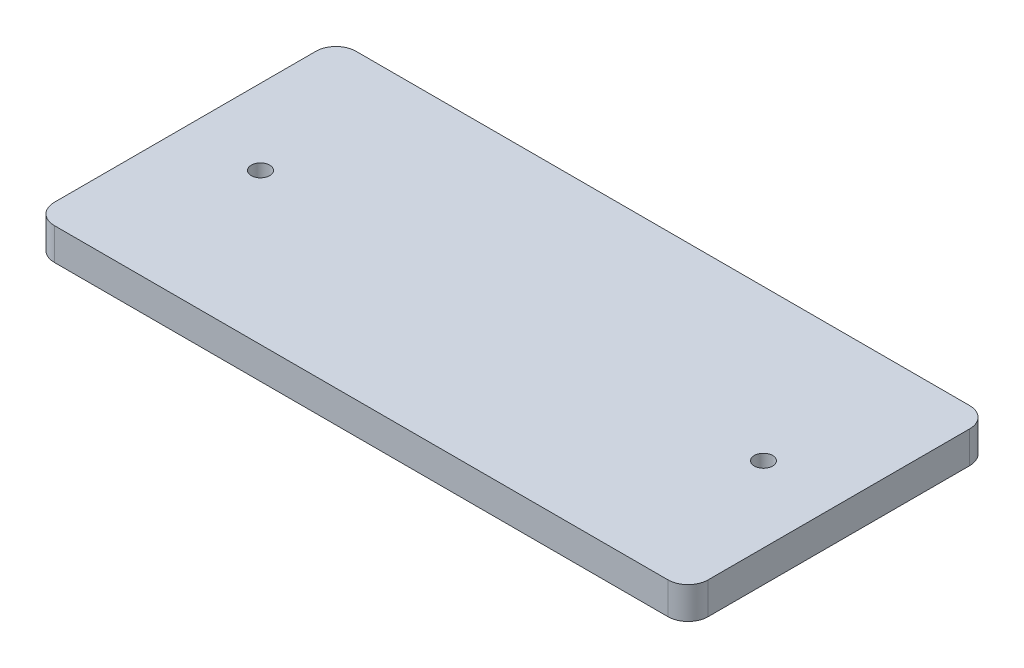
ISO-10303-21;
HEADER;
FILE_DESCRIPTION(('STEP AP214'),'2;1');
FILE_NAME('part.step','',(''),(''),'','','');
FILE_SCHEMA(('AUTOMOTIVE_DESIGN { 1 0 10303 214 1 1 1 1 }'));
ENDSEC;
DATA;
#1=APPLICATION_CONTEXT('core data for automotive mechanical design processes');
#2=APPLICATION_PROTOCOL_DEFINITION('international standard','automotive_design',2000,#1);
#3=PRODUCT_CONTEXT('',#1,'mechanical');
#4=PRODUCT('Part','Part','',(#3));
#5=PRODUCT_RELATED_PRODUCT_CATEGORY('part','',(#4));
#6=PRODUCT_DEFINITION_FORMATION('','',#4);
#7=PRODUCT_DEFINITION_CONTEXT('part definition',#1,'design');
#8=PRODUCT_DEFINITION('design','',#6,#7);
#9=PRODUCT_DEFINITION_SHAPE('','',#8);
#10=(LENGTH_UNIT() NAMED_UNIT(*) SI_UNIT(.MILLI.,.METRE.));
#11=(NAMED_UNIT(*) PLANE_ANGLE_UNIT() SI_UNIT($,.RADIAN.));
#12=(NAMED_UNIT(*) SI_UNIT($,.STERADIAN.) SOLID_ANGLE_UNIT());
#13=UNCERTAINTY_MEASURE_WITH_UNIT(LENGTH_MEASURE(1.E-05),#10,'distance_accuracy_value','');
#14=(GEOMETRIC_REPRESENTATION_CONTEXT(3) GLOBAL_UNCERTAINTY_ASSIGNED_CONTEXT((#13)) GLOBAL_UNIT_ASSIGNED_CONTEXT((#10,
#11,#12)) REPRESENTATION_CONTEXT('',''));
#15=CARTESIAN_POINT('',(0.,0.,0.));
#16=DIRECTION('',(0.,0.,1.));
#17=DIRECTION('',(1.,0.,0.));
#18=AXIS2_PLACEMENT_3D('',#15,#16,#17);
#19=CARTESIAN_POINT('',(0.,150.622,0.));
#20=DIRECTION('',(0.,1.,0.));
#21=DIRECTION('',(0.,0.,1.));
#22=AXIS2_PLACEMENT_3D('',#19,#20,#21);
#23=PLANE('',#22);
#24=CARTESIAN_POINT('',(-50.7957697616357,150.622,181.505943707725));
#25=DIRECTION('',(0.,1.,0.));
#26=DIRECTION('',(0.,0.,1.));
#27=AXIS2_PLACEMENT_3D('',#24,#25,#26);
#28=CIRCLE('',#27,1.82879999999999);
#29=CARTESIAN_POINT('',(-50.7957697616357,150.622,183.334743707725));
#30=VERTEX_POINT('',#29);
#31=EDGE_CURVE('E167',#30,#30,#28,.T.);
#32=ORIENTED_EDGE('',*,*,#31,.F.);
#33=EDGE_LOOP('',(#32));
#34=FACE_BOUND('',#33,.T.);
#35=DIRECTION('',(-1.,0.,0.));
#36=VECTOR('',#35,1.);
#37=CARTESIAN_POINT('',(-65.7957697616357,150.622,151.505943707725));
#38=LINE('',#37,#36);
#39=CARTESIAN_POINT('',(60.2042302383643,150.622,151.505943707725));
#40=VERTEX_POINT('',#39);
#41=CARTESIAN_POINT('',(-61.7957697616357,150.622,151.505943707725));
#42=VERTEX_POINT('',#41);
#43=EDGE_CURVE('E174',#40,#42,#38,.T.);
#44=ORIENTED_EDGE('',*,*,#43,.T.);
#45=CARTESIAN_POINT('',(-61.7957697616357,150.622,155.505943707725));
#46=DIRECTION('',(0.,1.,0.));
#47=DIRECTION('',(0.,0.,1.));
#48=AXIS2_PLACEMENT_3D('',#45,#46,#47);
#49=CIRCLE('',#48,4.);
#50=CARTESIAN_POINT('',(-65.7957697616357,150.622,155.505943707725));
#51=VERTEX_POINT('',#50);
#52=EDGE_CURVE('E151',#42,#51,#49,.T.);
#53=ORIENTED_EDGE('',*,*,#52,.T.);
#54=DIRECTION('',(0.,0.,1.));
#55=VECTOR('',#54,1.);
#56=CARTESIAN_POINT('',(-65.7957697616357,150.622,151.505943707725));
#57=LINE('',#56,#55);
#58=CARTESIAN_POINT('',(-65.7957697616357,150.622,207.505943707725));
#59=VERTEX_POINT('',#58);
#60=EDGE_CURVE('E121',#51,#59,#57,.T.);
#61=ORIENTED_EDGE('',*,*,#60,.T.);
#62=CARTESIAN_POINT('',(-61.7957697616356,150.622,207.505943707725));
#63=DIRECTION('',(0.,1.,0.));
#64=DIRECTION('',(0.,0.,1.));
#65=AXIS2_PLACEMENT_3D('',#62,#63,#64);
#66=CIRCLE('',#65,4.);
#67=CARTESIAN_POINT('',(-61.7957697616356,150.622,211.505943707725));
#68=VERTEX_POINT('',#67);
#69=EDGE_CURVE('E58',#59,#68,#66,.T.);
#70=ORIENTED_EDGE('',*,*,#69,.T.);
#71=DIRECTION('',(1.,0.,0.));
#72=VECTOR('',#71,1.);
#73=CARTESIAN_POINT('',(-65.7957697616357,150.622,211.505943707725));
#74=LINE('',#73,#72);
#75=CARTESIAN_POINT('',(60.2042302383643,150.622,211.505943707725));
#76=VERTEX_POINT('',#75);
#77=EDGE_CURVE('E137',#68,#76,#74,.T.);
#78=ORIENTED_EDGE('',*,*,#77,.T.);
#79=CARTESIAN_POINT('',(60.2042302383643,150.622,207.505943707725));
#80=DIRECTION('',(0.,1.,0.));
#81=DIRECTION('',(0.,0.,1.));
#82=AXIS2_PLACEMENT_3D('',#79,#80,#81);
#83=CIRCLE('',#82,4.);
#84=CARTESIAN_POINT('',(64.2042302383643,150.622,207.505943707725));
#85=VERTEX_POINT('',#84);
#86=EDGE_CURVE('E146',#76,#85,#83,.T.);
#87=ORIENTED_EDGE('',*,*,#86,.T.);
#88=DIRECTION('',(0.,0.,-1.));
#89=VECTOR('',#88,1.);
#90=CARTESIAN_POINT('',(64.2042302383643,150.622,151.505943707725));
#91=LINE('',#90,#89);
#92=CARTESIAN_POINT('',(64.2042302383643,150.622,155.505943707725));
#93=VERTEX_POINT('',#92);
#94=EDGE_CURVE('E131',#85,#93,#91,.T.);
#95=ORIENTED_EDGE('',*,*,#94,.T.);
#96=CARTESIAN_POINT('',(60.2042302383643,150.622,155.505943707725));
#97=DIRECTION('',(0.,1.,0.));
#98=DIRECTION('',(0.,0.,1.));
#99=AXIS2_PLACEMENT_3D('',#96,#97,#98);
#100=CIRCLE('',#99,4.);
#101=EDGE_CURVE('E148',#93,#40,#100,.T.);
#102=ORIENTED_EDGE('',*,*,#101,.T.);
#103=EDGE_LOOP('',(#44,#53,#61,#70,#78,#87,#95,#102));
#104=FACE_BOUND('',#103,.T.);
#105=CARTESIAN_POINT('',(49.2042302383644,150.622,181.505943707725));
#106=DIRECTION('',(0.,1.,0.));
#107=DIRECTION('',(0.,0.,1.));
#108=AXIS2_PLACEMENT_3D('',#105,#106,#107);
#109=CIRCLE('',#108,1.82879999999999);
#110=CARTESIAN_POINT('',(49.2042302383644,150.622,183.334743707725));
#111=VERTEX_POINT('',#110);
#112=EDGE_CURVE('E179',#111,#111,#109,.T.);
#113=ORIENTED_EDGE('',*,*,#112,.F.);
#114=EDGE_LOOP('',(#113));
#115=FACE_BOUND('',#114,.T.);
#116=ADVANCED_FACE('F36',(#34,#104,#115),#23,.T.);
#117=CARTESIAN_POINT('',(0.,144.272,0.));
#118=DIRECTION('',(0.,1.,0.));
#119=DIRECTION('',(0.,0.,1.));
#120=AXIS2_PLACEMENT_3D('',#117,#118,#119);
#121=PLANE('',#120);
#122=DIRECTION('',(0.,0.,1.));
#123=VECTOR('',#122,1.);
#124=CARTESIAN_POINT('',(-65.7957697616357,144.272,151.505943707725));
#125=LINE('',#124,#123);
#126=CARTESIAN_POINT('',(-65.7957697616357,144.272,155.505943707725));
#127=VERTEX_POINT('',#126);
#128=CARTESIAN_POINT('',(-65.7957697616357,144.272,207.505943707725));
#129=VERTEX_POINT('',#128);
#130=EDGE_CURVE('E119',#127,#129,#125,.T.);
#131=ORIENTED_EDGE('',*,*,#130,.F.);
#132=CARTESIAN_POINT('',(-61.7957697616357,144.272,155.505943707725));
#133=DIRECTION('',(0.,1.,0.));
#134=DIRECTION('',(0.,0.,1.));
#135=AXIS2_PLACEMENT_3D('',#132,#133,#134);
#136=CIRCLE('',#135,4.);
#137=CARTESIAN_POINT('',(-61.7957697616357,144.272,151.505943707725));
#138=VERTEX_POINT('',#137);
#139=EDGE_CURVE('E102',#127,#138,#136,.F.);
#140=ORIENTED_EDGE('',*,*,#139,.T.);
#141=DIRECTION('',(-1.,0.,0.));
#142=VECTOR('',#141,1.);
#143=CARTESIAN_POINT('',(-65.7957697616357,144.272,151.505943707725));
#144=LINE('',#143,#142);
#145=CARTESIAN_POINT('',(60.2042302383643,144.272,151.505943707725));
#146=VERTEX_POINT('',#145);
#147=EDGE_CURVE('E129',#146,#138,#144,.T.);
#148=ORIENTED_EDGE('',*,*,#147,.F.);
#149=CARTESIAN_POINT('',(60.2042302383643,144.272,155.505943707725));
#150=DIRECTION('',(0.,1.,0.));
#151=DIRECTION('',(0.,0.,1.));
#152=AXIS2_PLACEMENT_3D('',#149,#150,#151);
#153=CIRCLE('',#152,4.);
#154=CARTESIAN_POINT('',(64.2042302383643,144.272,155.505943707725));
#155=VERTEX_POINT('',#154);
#156=EDGE_CURVE('E140',#146,#155,#153,.F.);
#157=ORIENTED_EDGE('',*,*,#156,.T.);
#158=DIRECTION('',(0.,0.,-1.));
#159=VECTOR('',#158,1.);
#160=CARTESIAN_POINT('',(64.2042302383643,144.272,151.505943707725));
#161=LINE('',#160,#159);
#162=CARTESIAN_POINT('',(64.2042302383643,144.272,207.505943707725));
#163=VERTEX_POINT('',#162);
#164=EDGE_CURVE('E133',#163,#155,#161,.T.);
#165=ORIENTED_EDGE('',*,*,#164,.F.);
#166=CARTESIAN_POINT('',(60.2042302383643,144.272,207.505943707725));
#167=DIRECTION('',(0.,1.,0.));
#168=DIRECTION('',(0.,0.,1.));
#169=AXIS2_PLACEMENT_3D('',#166,#167,#168);
#170=CIRCLE('',#169,4.);
#171=CARTESIAN_POINT('',(60.2042302383643,144.272,211.505943707725));
#172=VERTEX_POINT('',#171);
#173=EDGE_CURVE('E122',#163,#172,#170,.F.);
#174=ORIENTED_EDGE('',*,*,#173,.T.);
#175=DIRECTION('',(1.,0.,0.));
#176=VECTOR('',#175,1.);
#177=CARTESIAN_POINT('',(-65.7957697616357,144.272,211.505943707725));
#178=LINE('',#177,#176);
#179=CARTESIAN_POINT('',(-61.7957697616356,144.272,211.505943707725));
#180=VERTEX_POINT('',#179);
#181=EDGE_CURVE('E128',#180,#172,#178,.T.);
#182=ORIENTED_EDGE('',*,*,#181,.F.);
#183=CARTESIAN_POINT('',(-61.7957697616356,144.272,207.505943707725));
#184=DIRECTION('',(0.,1.,0.));
#185=DIRECTION('',(0.,0.,1.));
#186=AXIS2_PLACEMENT_3D('',#183,#184,#185);
#187=CIRCLE('',#186,4.);
#188=EDGE_CURVE('E113',#180,#129,#187,.F.);
#189=ORIENTED_EDGE('',*,*,#188,.T.);
#190=EDGE_LOOP('',(#131,#140,#148,#157,#165,#174,#182,#189));
#191=FACE_BOUND('',#190,.T.);
#192=CARTESIAN_POINT('',(-50.7957697616357,144.272,181.505943707725));
#193=DIRECTION('',(0.,1.,0.));
#194=DIRECTION('',(0.,0.,1.));
#195=AXIS2_PLACEMENT_3D('',#192,#193,#194);
#196=CIRCLE('',#195,1.82879999999999);
#197=CARTESIAN_POINT('',(-50.7957697616357,144.272,183.334743707725));
#198=VERTEX_POINT('',#197);
#199=EDGE_CURVE('E169',#198,#198,#196,.T.);
#200=ORIENTED_EDGE('',*,*,#199,.T.);
#201=EDGE_LOOP('',(#200));
#202=FACE_BOUND('',#201,.T.);
#203=CARTESIAN_POINT('',(49.2042302383644,144.272,181.505943707725));
#204=DIRECTION('',(0.,1.,0.));
#205=DIRECTION('',(0.,0.,1.));
#206=AXIS2_PLACEMENT_3D('',#203,#204,#205);
#207=CIRCLE('',#206,1.82879999999999);
#208=CARTESIAN_POINT('',(49.2042302383644,144.272,183.334743707725));
#209=VERTEX_POINT('',#208);
#210=EDGE_CURVE('E181',#209,#209,#207,.T.);
#211=ORIENTED_EDGE('',*,*,#210,.T.);
#212=EDGE_LOOP('',(#211));
#213=FACE_BOUND('',#212,.T.);
#214=ADVANCED_FACE('F125',(#191,#202,#213),#121,.F.);
#215=CARTESIAN_POINT('',(64.2042302383643,150.622,151.505943707725));
#216=DIRECTION('',(-1.,0.,0.));
#217=DIRECTION('',(0.,0.,1.));
#218=AXIS2_PLACEMENT_3D('',#215,#216,#217);
#219=PLANE('',#218);
#220=ORIENTED_EDGE('',*,*,#164,.T.);
#221=DIRECTION('',(0.,-1.,0.));
#222=VECTOR('',#221,1.);
#223=CARTESIAN_POINT('',(64.2042302383643,150.622,155.505943707725));
#224=LINE('',#223,#222);
#225=EDGE_CURVE('E11',#155,#93,#224,.F.);
#226=ORIENTED_EDGE('',*,*,#225,.T.);
#227=ORIENTED_EDGE('',*,*,#94,.F.);
#228=DIRECTION('',(0.,-1.,0.));
#229=VECTOR('',#228,1.);
#230=CARTESIAN_POINT('',(64.2042302383643,150.622,207.505943707725));
#231=LINE('',#230,#229);
#232=EDGE_CURVE('E44',#85,#163,#231,.T.);
#233=ORIENTED_EDGE('',*,*,#232,.T.);
#234=EDGE_LOOP('',(#220,#226,#227,#233));
#235=FACE_BOUND('',#234,.T.);
#236=ADVANCED_FACE('F162',(#235),#219,.F.);
#237=CARTESIAN_POINT('',(-65.7957697616357,150.622,151.505943707725));
#238=DIRECTION('',(0.,0.,1.));
#239=DIRECTION('',(1.,0.,0.));
#240=AXIS2_PLACEMENT_3D('',#237,#238,#239);
#241=PLANE('',#240);
#242=ORIENTED_EDGE('',*,*,#147,.T.);
#243=DIRECTION('',(0.,-1.,0.));
#244=VECTOR('',#243,1.);
#245=CARTESIAN_POINT('',(-61.7957697616357,150.622,151.505943707725));
#246=LINE('',#245,#244);
#247=EDGE_CURVE('E107',#138,#42,#246,.F.);
#248=ORIENTED_EDGE('',*,*,#247,.T.);
#249=ORIENTED_EDGE('',*,*,#43,.F.);
#250=DIRECTION('',(0.,-1.,0.));
#251=VECTOR('',#250,1.);
#252=CARTESIAN_POINT('',(60.2042302383643,150.622,151.505943707725));
#253=LINE('',#252,#251);
#254=EDGE_CURVE('E112',#40,#146,#253,.T.);
#255=ORIENTED_EDGE('',*,*,#254,.T.);
#256=EDGE_LOOP('',(#242,#248,#249,#255));
#257=FACE_BOUND('',#256,.T.);
#258=ADVANCED_FACE('F207',(#257),#241,.F.);
#259=CARTESIAN_POINT('',(-65.7957697616357,150.622,151.505943707725));
#260=DIRECTION('',(1.,0.,0.));
#261=DIRECTION('',(0.,0.,-1.));
#262=AXIS2_PLACEMENT_3D('',#259,#260,#261);
#263=PLANE('',#262);
#264=ORIENTED_EDGE('',*,*,#60,.F.);
#265=DIRECTION('',(0.,-1.,0.));
#266=VECTOR('',#265,1.);
#267=CARTESIAN_POINT('',(-65.7957697616357,150.622,155.505943707725));
#268=LINE('',#267,#266);
#269=EDGE_CURVE('E106',#51,#127,#268,.T.);
#270=ORIENTED_EDGE('',*,*,#269,.T.);
#271=ORIENTED_EDGE('',*,*,#130,.T.);
#272=DIRECTION('',(0.,-1.,0.));
#273=VECTOR('',#272,1.);
#274=CARTESIAN_POINT('',(-65.7957697616357,150.622,207.505943707725));
#275=LINE('',#274,#273);
#276=EDGE_CURVE('E123',#129,#59,#275,.F.);
#277=ORIENTED_EDGE('',*,*,#276,.T.);
#278=EDGE_LOOP('',(#264,#270,#271,#277));
#279=FACE_BOUND('',#278,.T.);
#280=ADVANCED_FACE('F118',(#279),#263,.F.);
#281=CARTESIAN_POINT('',(-65.7957697616357,150.622,211.505943707725));
#282=DIRECTION('',(0.,0.,-1.));
#283=DIRECTION('',(-1.,0.,0.));
#284=AXIS2_PLACEMENT_3D('',#281,#282,#283);
#285=PLANE('',#284);
#286=ORIENTED_EDGE('',*,*,#77,.F.);
#287=DIRECTION('',(0.,-1.,0.));
#288=VECTOR('',#287,1.);
#289=CARTESIAN_POINT('',(-61.7957697616356,150.622,211.505943707725));
#290=LINE('',#289,#288);
#291=EDGE_CURVE('E154',#68,#180,#290,.T.);
#292=ORIENTED_EDGE('',*,*,#291,.T.);
#293=ORIENTED_EDGE('',*,*,#181,.T.);
#294=DIRECTION('',(0.,-1.,0.));
#295=VECTOR('',#294,1.);
#296=CARTESIAN_POINT('',(60.2042302383643,150.622,211.505943707725));
#297=LINE('',#296,#295);
#298=EDGE_CURVE('E51',#172,#76,#297,.F.);
#299=ORIENTED_EDGE('',*,*,#298,.T.);
#300=EDGE_LOOP('',(#286,#292,#293,#299));
#301=FACE_BOUND('',#300,.T.);
#302=ADVANCED_FACE('F202',(#301),#285,.F.);
#303=CARTESIAN_POINT('',(-50.7957697616357,150.622,181.505943707725));
#304=DIRECTION('',(0.,-1.,0.));
#305=DIRECTION('',(0.,0.,-1.));
#306=AXIS2_PLACEMENT_3D('',#303,#304,#305);
#307=CYLINDRICAL_SURFACE('',#306,1.82879999999999);
#308=ORIENTED_EDGE('',*,*,#31,.T.);
#309=EDGE_LOOP('',(#308));
#310=FACE_BOUND('',#309,.T.);
#311=ORIENTED_EDGE('',*,*,#199,.F.);
#312=EDGE_LOOP('',(#311));
#313=FACE_BOUND('',#312,.T.);
#314=ADVANCED_FACE('F199',(#310,#313),#307,.F.);
#315=CARTESIAN_POINT('',(49.2042302383644,150.622,181.505943707725));
#316=DIRECTION('',(0.,-1.,0.));
#317=DIRECTION('',(0.,0.,-1.));
#318=AXIS2_PLACEMENT_3D('',#315,#316,#317);
#319=CYLINDRICAL_SURFACE('',#318,1.82879999999999);
#320=ORIENTED_EDGE('',*,*,#112,.T.);
#321=EDGE_LOOP('',(#320));
#322=FACE_BOUND('',#321,.T.);
#323=ORIENTED_EDGE('',*,*,#210,.F.);
#324=EDGE_LOOP('',(#323));
#325=FACE_BOUND('',#324,.T.);
#326=ADVANCED_FACE('F187',(#322,#325),#319,.F.);
#327=CARTESIAN_POINT('',(-61.7957697616357,150.622,155.505943707725));
#328=DIRECTION('',(0.,-1.,0.));
#329=DIRECTION('',(0.,0.,-1.));
#330=AXIS2_PLACEMENT_3D('',#327,#328,#329);
#331=CYLINDRICAL_SURFACE('',#330,4.);
#332=ORIENTED_EDGE('',*,*,#52,.F.);
#333=ORIENTED_EDGE('',*,*,#247,.F.);
#334=ORIENTED_EDGE('',*,*,#139,.F.);
#335=ORIENTED_EDGE('',*,*,#269,.F.);
#336=EDGE_LOOP('',(#332,#333,#334,#335));
#337=FACE_BOUND('',#336,.T.);
#338=ADVANCED_FACE('F105',(#337),#331,.T.);
#339=CARTESIAN_POINT('',(-61.7957697616356,150.622,207.505943707725));
#340=DIRECTION('',(0.,-1.,0.));
#341=DIRECTION('',(0.,0.,-1.));
#342=AXIS2_PLACEMENT_3D('',#339,#340,#341);
#343=CYLINDRICAL_SURFACE('',#342,4.);
#344=ORIENTED_EDGE('',*,*,#69,.F.);
#345=ORIENTED_EDGE('',*,*,#276,.F.);
#346=ORIENTED_EDGE('',*,*,#188,.F.);
#347=ORIENTED_EDGE('',*,*,#291,.F.);
#348=EDGE_LOOP('',(#344,#345,#346,#347));
#349=FACE_BOUND('',#348,.T.);
#350=ADVANCED_FACE('F215',(#349),#343,.T.);
#351=CARTESIAN_POINT('',(60.2042302383643,150.622,155.505943707725));
#352=DIRECTION('',(0.,-1.,0.));
#353=DIRECTION('',(0.,0.,-1.));
#354=AXIS2_PLACEMENT_3D('',#351,#352,#353);
#355=CYLINDRICAL_SURFACE('',#354,4.);
#356=ORIENTED_EDGE('',*,*,#101,.F.);
#357=ORIENTED_EDGE('',*,*,#225,.F.);
#358=ORIENTED_EDGE('',*,*,#156,.F.);
#359=ORIENTED_EDGE('',*,*,#254,.F.);
#360=EDGE_LOOP('',(#356,#357,#358,#359));
#361=FACE_BOUND('',#360,.T.);
#362=ADVANCED_FACE('F217',(#361),#355,.T.);
#363=CARTESIAN_POINT('',(60.2042302383643,150.622,207.505943707725));
#364=DIRECTION('',(0.,-1.,0.));
#365=DIRECTION('',(0.,0.,-1.));
#366=AXIS2_PLACEMENT_3D('',#363,#364,#365);
#367=CYLINDRICAL_SURFACE('',#366,4.);
#368=ORIENTED_EDGE('',*,*,#86,.F.);
#369=ORIENTED_EDGE('',*,*,#298,.F.);
#370=ORIENTED_EDGE('',*,*,#173,.F.);
#371=ORIENTED_EDGE('',*,*,#232,.F.);
#372=EDGE_LOOP('',(#368,#369,#370,#371));
#373=FACE_BOUND('',#372,.T.);
#374=ADVANCED_FACE('F38',(#373),#367,.T.);
#375=CLOSED_SHELL('',(#116,#214,#236,#258,#280,#302,#314,#326,#338,#350,#362,#374));
#376=MANIFOLD_SOLID_BREP('B2',#375);
#377=ADVANCED_BREP_SHAPE_REPRESENTATION('',(#18,#376),#14);
#378=SHAPE_DEFINITION_REPRESENTATION(#9,#377);
ENDSEC;
END-ISO-10303-21;
